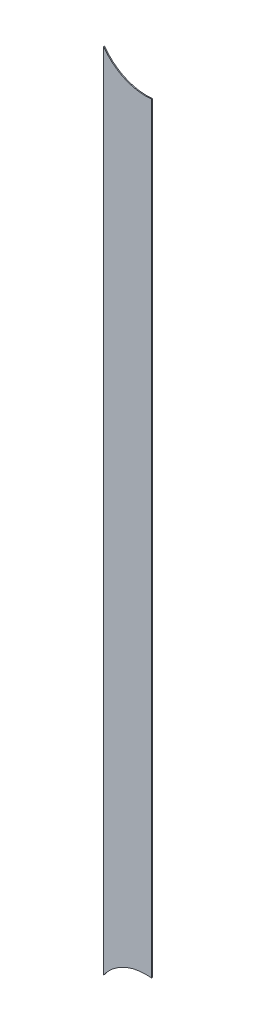
ISO-10303-21;
HEADER;
FILE_DESCRIPTION(('STEP AP214'),'2;1');
FILE_NAME('part.step','',(''),(''),'','','');
FILE_SCHEMA(('AUTOMOTIVE_DESIGN { 1 0 10303 214 1 1 1 1 }'));
ENDSEC;
DATA;
#1=APPLICATION_CONTEXT('core data for automotive mechanical design processes');
#2=APPLICATION_PROTOCOL_DEFINITION('international standard','automotive_design',2000,#1);
#3=PRODUCT_CONTEXT('',#1,'mechanical');
#4=PRODUCT('Part','Part','',(#3));
#5=PRODUCT_RELATED_PRODUCT_CATEGORY('part','',(#4));
#6=PRODUCT_DEFINITION_FORMATION('','',#4);
#7=PRODUCT_DEFINITION_CONTEXT('part definition',#1,'design');
#8=PRODUCT_DEFINITION('design','',#6,#7);
#9=PRODUCT_DEFINITION_SHAPE('','',#8);
#10=(LENGTH_UNIT() NAMED_UNIT(*) SI_UNIT(.MILLI.,.METRE.));
#11=(NAMED_UNIT(*) PLANE_ANGLE_UNIT() SI_UNIT($,.RADIAN.));
#12=(NAMED_UNIT(*) SI_UNIT($,.STERADIAN.) SOLID_ANGLE_UNIT());
#13=UNCERTAINTY_MEASURE_WITH_UNIT(LENGTH_MEASURE(1.E-05),#10,'distance_accuracy_value','');
#14=(GEOMETRIC_REPRESENTATION_CONTEXT(3) GLOBAL_UNCERTAINTY_ASSIGNED_CONTEXT((#13)) GLOBAL_UNIT_ASSIGNED_CONTEXT((#10,
#11,#12)) REPRESENTATION_CONTEXT('',''));
#15=CARTESIAN_POINT('',(0.,0.,0.));
#16=DIRECTION('',(0.,0.,1.));
#17=DIRECTION('',(1.,0.,0.));
#18=AXIS2_PLACEMENT_3D('',#15,#16,#17);
#19=CARTESIAN_POINT('',(0.,0.,0.));
#20=DIRECTION('',(0.,0.,1.));
#21=DIRECTION('',(1.,0.,0.));
#22=AXIS2_PLACEMENT_3D('',#19,#20,#21);
#23=PLANE('',#22);
#24=DIRECTION('',(0.,-1.,0.));
#25=VECTOR('',#24,1.);
#26=CARTESIAN_POINT('',(-24.7,20.9347524157502,0.));
#27=LINE('',#26,#25);
#28=CARTESIAN_POINT('',(-24.7,-20.9347524157502,0.));
#29=VERTEX_POINT('',#28);
#30=CARTESIAN_POINT('',(-24.7,20.9347524157502,0.));
#31=VERTEX_POINT('',#30);
#32=EDGE_CURVE('E62',#29,#31,#27,.F.);
#33=ORIENTED_EDGE('',*,*,#32,.F.);
#34=CARTESIAN_POINT('',(-22.5,-22.5,0.));
#35=DIRECTION('',(0.,0.,1.));
#36=DIRECTION('',(1.,0.,0.));
#37=AXIS2_PLACEMENT_3D('',#34,#35,#36);
#38=CIRCLE('',#37,2.7);
#39=CARTESIAN_POINT('',(-22.2,-19.8167184270003,0.));
#40=VERTEX_POINT('',#39);
#41=EDGE_CURVE('E69',#29,#40,#38,.F.);
#42=ORIENTED_EDGE('',*,*,#41,.T.);
#43=DIRECTION('',(0.,1.,0.));
#44=VECTOR('',#43,1.);
#45=CARTESIAN_POINT('',(-22.2,-19.8167184270003,0.));
#46=LINE('',#45,#44);
#47=CARTESIAN_POINT('',(-22.2,19.8167184270003,0.));
#48=VERTEX_POINT('',#47);
#49=EDGE_CURVE('E64',#48,#40,#46,.F.);
#50=ORIENTED_EDGE('',*,*,#49,.F.);
#51=CARTESIAN_POINT('',(-22.5,22.5,0.));
#52=DIRECTION('',(0.,0.,1.));
#53=DIRECTION('',(1.,0.,0.));
#54=AXIS2_PLACEMENT_3D('',#51,#52,#53);
#55=CIRCLE('',#54,2.7);
#56=EDGE_CURVE('E20',#48,#31,#55,.F.);
#57=ORIENTED_EDGE('',*,*,#56,.T.);
#58=EDGE_LOOP('',(#33,#42,#50,#57));
#59=FACE_BOUND('',#58,.T.);
#60=ADVANCED_FACE('F17',(#59),#23,.T.);
#61=CARTESIAN_POINT('',(-22.5,22.5,-0.05));
#62=DIRECTION('',(0.,0.,1.));
#63=DIRECTION('',(1.,0.,0.));
#64=AXIS2_PLACEMENT_3D('',#61,#62,#63);
#65=CYLINDRICAL_SURFACE('',#64,2.7);
#66=DIRECTION('',(0.,0.,1.));
#67=VECTOR('',#66,1.);
#68=CARTESIAN_POINT('',(-22.2,19.8167184270003,-0.05));
#69=LINE('',#68,#67);
#70=CARTESIAN_POINT('',(-22.2,19.8167184270003,-0.05));
#71=VERTEX_POINT('',#70);
#72=EDGE_CURVE('E58',#71,#48,#69,.T.);
#73=ORIENTED_EDGE('',*,*,#72,.F.);
#74=CARTESIAN_POINT('',(-22.5,22.5,-0.05));
#75=DIRECTION('',(0.,0.,1.));
#76=DIRECTION('',(1.,0.,0.));
#77=AXIS2_PLACEMENT_3D('',#74,#75,#76);
#78=CIRCLE('',#77,2.7);
#79=CARTESIAN_POINT('',(-24.7,20.9347524157502,-0.05));
#80=VERTEX_POINT('',#79);
#81=EDGE_CURVE('E66',#71,#80,#78,.F.);
#82=ORIENTED_EDGE('',*,*,#81,.T.);
#83=DIRECTION('',(0.,0.,1.));
#84=VECTOR('',#83,1.);
#85=CARTESIAN_POINT('',(-24.7,20.9347524157502,-0.05));
#86=LINE('',#85,#84);
#87=EDGE_CURVE('E59',#31,#80,#86,.F.);
#88=ORIENTED_EDGE('',*,*,#87,.F.);
#89=ORIENTED_EDGE('',*,*,#56,.F.);
#90=EDGE_LOOP('',(#73,#82,#88,#89));
#91=FACE_BOUND('',#90,.T.);
#92=ADVANCED_FACE('F56',(#91),#65,.F.);
#93=CARTESIAN_POINT('',(-24.7,20.9347524157502,-0.05));
#94=DIRECTION('',(-1.,0.,0.));
#95=DIRECTION('',(0.,-1.,0.));
#96=AXIS2_PLACEMENT_3D('',#93,#94,#95);
#97=PLANE('',#96);
#98=DIRECTION('',(0.,1.,0.));
#99=VECTOR('',#98,1.);
#100=CARTESIAN_POINT('',(-24.7,0.,-0.05));
#101=LINE('',#100,#99);
#102=CARTESIAN_POINT('',(-24.7,-20.9347524157502,-0.05));
#103=VERTEX_POINT('',#102);
#104=EDGE_CURVE('E80',#80,#103,#101,.F.);
#105=ORIENTED_EDGE('',*,*,#104,.T.);
#106=DIRECTION('',(0.,0.,1.));
#107=VECTOR('',#106,1.);
#108=CARTESIAN_POINT('',(-24.7,-20.9347524157502,-0.05));
#109=LINE('',#108,#107);
#110=EDGE_CURVE('E72',#103,#29,#109,.T.);
#111=ORIENTED_EDGE('',*,*,#110,.T.);
#112=ORIENTED_EDGE('',*,*,#32,.T.);
#113=ORIENTED_EDGE('',*,*,#87,.T.);
#114=EDGE_LOOP('',(#105,#111,#112,#113));
#115=FACE_BOUND('',#114,.T.);
#116=ADVANCED_FACE('F86',(#115),#97,.T.);
#117=CARTESIAN_POINT('',(-22.5,-22.5,-0.05));
#118=DIRECTION('',(0.,0.,1.));
#119=DIRECTION('',(1.,0.,0.));
#120=AXIS2_PLACEMENT_3D('',#117,#118,#119);
#121=CYLINDRICAL_SURFACE('',#120,2.7);
#122=ORIENTED_EDGE('',*,*,#110,.F.);
#123=CARTESIAN_POINT('',(-22.5,-22.5,-0.05));
#124=DIRECTION('',(0.,0.,1.));
#125=DIRECTION('',(1.,0.,0.));
#126=AXIS2_PLACEMENT_3D('',#123,#124,#125);
#127=CIRCLE('',#126,2.7);
#128=CARTESIAN_POINT('',(-22.2,-19.8167184270003,-0.05));
#129=VERTEX_POINT('',#128);
#130=EDGE_CURVE('E26',#103,#129,#127,.F.);
#131=ORIENTED_EDGE('',*,*,#130,.T.);
#132=DIRECTION('',(0.,0.,1.));
#133=VECTOR('',#132,1.);
#134=CARTESIAN_POINT('',(-22.2,-19.8167184270003,-0.05));
#135=LINE('',#134,#133);
#136=EDGE_CURVE('E34',#40,#129,#135,.F.);
#137=ORIENTED_EDGE('',*,*,#136,.F.);
#138=ORIENTED_EDGE('',*,*,#41,.F.);
#139=EDGE_LOOP('',(#122,#131,#137,#138));
#140=FACE_BOUND('',#139,.T.);
#141=ADVANCED_FACE('F91',(#140),#121,.F.);
#142=CARTESIAN_POINT('',(-22.2,-19.8167184270003,-0.05));
#143=DIRECTION('',(1.,0.,0.));
#144=DIRECTION('',(0.,1.,0.));
#145=AXIS2_PLACEMENT_3D('',#142,#143,#144);
#146=PLANE('',#145);
#147=DIRECTION('',(0.,1.,0.));
#148=VECTOR('',#147,1.);
#149=CARTESIAN_POINT('',(-22.2,0.,-0.05));
#150=LINE('',#149,#148);
#151=EDGE_CURVE('E11',#129,#71,#150,.T.);
#152=ORIENTED_EDGE('',*,*,#151,.T.);
#153=ORIENTED_EDGE('',*,*,#72,.T.);
#154=ORIENTED_EDGE('',*,*,#49,.T.);
#155=ORIENTED_EDGE('',*,*,#136,.T.);
#156=EDGE_LOOP('',(#152,#153,#154,#155));
#157=FACE_BOUND('',#156,.T.);
#158=ADVANCED_FACE('F63',(#157),#146,.T.);
#159=CARTESIAN_POINT('',(0.,0.,-0.05));
#160=DIRECTION('',(0.,0.,1.));
#161=DIRECTION('',(1.,0.,0.));
#162=AXIS2_PLACEMENT_3D('',#159,#160,#161);
#163=PLANE('',#162);
#164=ORIENTED_EDGE('',*,*,#130,.F.);
#165=ORIENTED_EDGE('',*,*,#104,.F.);
#166=ORIENTED_EDGE('',*,*,#81,.F.);
#167=ORIENTED_EDGE('',*,*,#151,.F.);
#168=EDGE_LOOP('',(#164,#165,#166,#167));
#169=FACE_BOUND('',#168,.T.);
#170=ADVANCED_FACE('F89',(#169),#163,.F.);
#171=CLOSED_SHELL('',(#60,#92,#116,#141,#158,#170));
#172=MANIFOLD_SOLID_BREP('B1',#171);
#173=ADVANCED_BREP_SHAPE_REPRESENTATION('',(#18,#172),#14);
#174=SHAPE_DEFINITION_REPRESENTATION(#9,#173);
ENDSEC;
END-ISO-10303-21;
